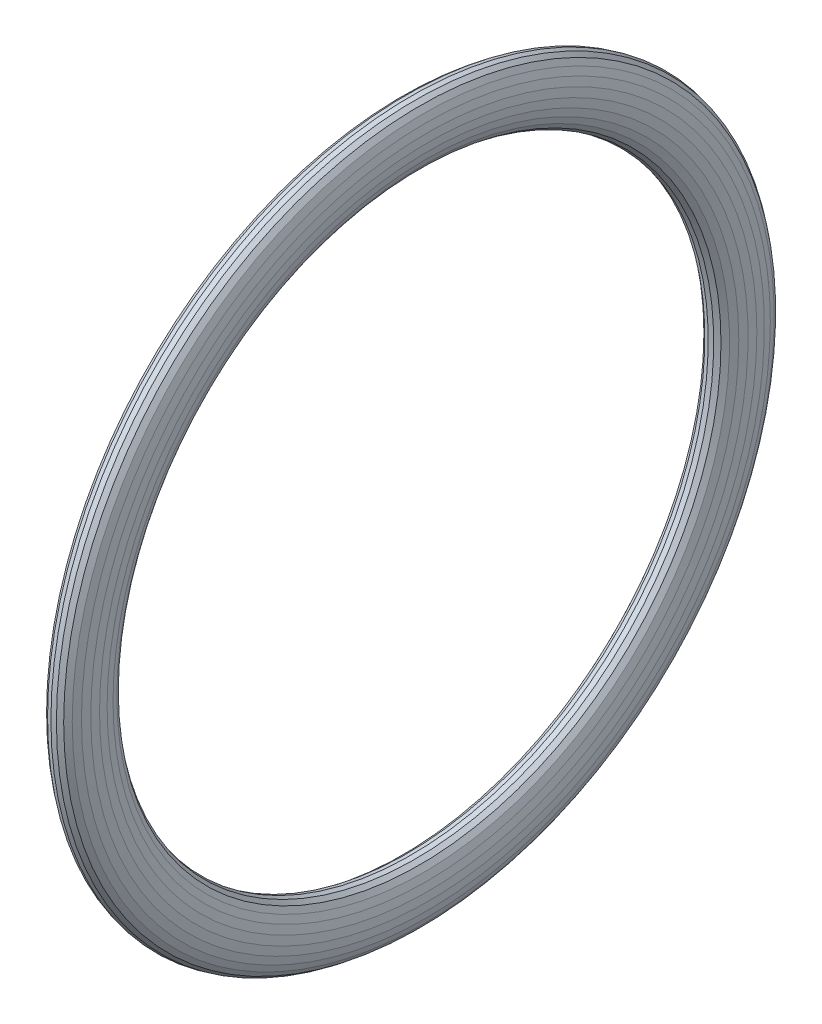
ISO-10303-21;
HEADER;
FILE_DESCRIPTION(('STEP AP214'),'2;1');
FILE_NAME('part.step','',(''),(''),'','','');
FILE_SCHEMA(('AUTOMOTIVE_DESIGN { 1 0 10303 214 1 1 1 1 }'));
ENDSEC;
DATA;
#1=APPLICATION_CONTEXT('core data for automotive mechanical design processes');
#2=APPLICATION_PROTOCOL_DEFINITION('international standard','automotive_design',2000,#1);
#3=PRODUCT_CONTEXT('',#1,'mechanical');
#4=PRODUCT('Part','Part','',(#3));
#5=PRODUCT_RELATED_PRODUCT_CATEGORY('part','',(#4));
#6=PRODUCT_DEFINITION_FORMATION('','',#4);
#7=PRODUCT_DEFINITION_CONTEXT('part definition',#1,'design');
#8=PRODUCT_DEFINITION('design','',#6,#7);
#9=PRODUCT_DEFINITION_SHAPE('','',#8);
#10=(LENGTH_UNIT() NAMED_UNIT(*) SI_UNIT(.MILLI.,.METRE.));
#11=(NAMED_UNIT(*) PLANE_ANGLE_UNIT() SI_UNIT($,.RADIAN.));
#12=(NAMED_UNIT(*) SI_UNIT($,.STERADIAN.) SOLID_ANGLE_UNIT());
#13=UNCERTAINTY_MEASURE_WITH_UNIT(LENGTH_MEASURE(1.E-05),#10,'distance_accuracy_value','');
#14=(GEOMETRIC_REPRESENTATION_CONTEXT(3) GLOBAL_UNCERTAINTY_ASSIGNED_CONTEXT((#13)) GLOBAL_UNIT_ASSIGNED_CONTEXT((#10,
#11,#12)) REPRESENTATION_CONTEXT('',''));
#15=CARTESIAN_POINT('',(0.,0.,0.));
#16=DIRECTION('',(0.,0.,1.));
#17=DIRECTION('',(1.,0.,0.));
#18=AXIS2_PLACEMENT_3D('',#15,#16,#17);
#19=CARTESIAN_POINT('',(-1.29500000000005,0.,0.));
#20=DIRECTION('',(-1.,0.,0.));
#21=DIRECTION('',(0.,0.,1.));
#22=AXIS2_PLACEMENT_3D('',#19,#20,#21);
#23=CONICAL_SURFACE('',#22,12.4,1.49955920854288);
#24=CARTESIAN_POINT('',(-1.27302215795644,0.,0.));
#25=DIRECTION('',(-1.,0.,0.));
#26=DIRECTION('',(0.,0.,1.));
#27=AXIS2_PLACEMENT_3D('',#24,#25,#26);
#28=CIRCLE('',#27,12.092005336328);
#29=CARTESIAN_POINT('',(-1.27302215795644,0.,12.092005336328));
#30=VERTEX_POINT('',#29);
#31=EDGE_CURVE('E113',#30,#30,#28,.T.);
#32=ORIENTED_EDGE('',*,*,#31,.F.);
#33=EDGE_LOOP('',(#32));
#34=FACE_BOUND('',#33,.T.);
#35=CARTESIAN_POINT('',(-1.29500000000005,0.,0.));
#36=DIRECTION('',(-1.,0.,0.));
#37=DIRECTION('',(0.,0.,1.));
#38=AXIS2_PLACEMENT_3D('',#35,#36,#37);
#39=CIRCLE('',#38,12.4);
#40=CARTESIAN_POINT('',(-1.29500000000005,0.,12.4));
#41=VERTEX_POINT('',#40);
#42=EDGE_CURVE('E10',#41,#41,#39,.T.);
#43=ORIENTED_EDGE('',*,*,#42,.T.);
#44=EDGE_LOOP('',(#43));
#45=FACE_BOUND('',#44,.T.);
#46=ADVANCED_FACE('F39',(#34,#45),#23,.F.);
#47=CARTESIAN_POINT('',(-1.27302215795644,0.,0.));
#48=DIRECTION('',(1.,0.,0.));
#49=DIRECTION('',(0.,0.,-1.));
#50=AXIS2_PLACEMENT_3D('',#47,#48,#49);
#51=CONICAL_SURFACE('',#50,12.707994663672,1.49955920854288);
#52=ORIENTED_EDGE('',*,*,#42,.F.);
#53=EDGE_LOOP('',(#52));
#54=FACE_BOUND('',#53,.T.);
#55=CARTESIAN_POINT('',(-1.27302215795644,0.,0.));
#56=DIRECTION('',(-1.,0.,0.));
#57=DIRECTION('',(0.,0.,1.));
#58=AXIS2_PLACEMENT_3D('',#55,#56,#57);
#59=CIRCLE('',#58,12.707994663672);
#60=CARTESIAN_POINT('',(-1.27302215795644,0.,12.707994663672));
#61=VERTEX_POINT('',#60);
#62=EDGE_CURVE('E44',#61,#61,#59,.T.);
#63=ORIENTED_EDGE('',*,*,#62,.T.);
#64=EDGE_LOOP('',(#63));
#65=FACE_BOUND('',#64,.T.);
#66=ADVANCED_FACE('F125',(#54,#65),#51,.T.);
#67=CARTESIAN_POINT('',(-1.20858638544097,0.,0.));
#68=DIRECTION('',(1.,0.,0.));
#69=DIRECTION('',(0.,0.,-1.));
#70=AXIS2_PLACEMENT_3D('',#67,#68,#69);
#71=CONICAL_SURFACE('',#70,12.995,1.34994764421995);
#72=ORIENTED_EDGE('',*,*,#62,.F.);
#73=EDGE_LOOP('',(#72));
#74=FACE_BOUND('',#73,.T.);
#75=CARTESIAN_POINT('',(-1.20858638544097,0.,0.));
#76=DIRECTION('',(-1.,0.,0.));
#77=DIRECTION('',(0.,0.,1.));
#78=AXIS2_PLACEMENT_3D('',#75,#76,#77);
#79=CIRCLE('',#78,12.995);
#80=CARTESIAN_POINT('',(-1.20858638544097,0.,12.995));
#81=VERTEX_POINT('',#80);
#82=EDGE_CURVE('E47',#81,#81,#79,.T.);
#83=ORIENTED_EDGE('',*,*,#82,.T.);
#84=EDGE_LOOP('',(#83));
#85=FACE_BOUND('',#84,.T.);
#86=ADVANCED_FACE('F127',(#74,#85),#71,.T.);
#87=CARTESIAN_POINT('',(-1.10608387386535,0.,0.));
#88=DIRECTION('',(1.,0.,0.));
#89=DIRECTION('',(0.,0.,-1.));
#90=AXIS2_PLACEMENT_3D('',#87,#88,#89);
#91=CONICAL_SURFACE('',#90,13.241457069612,1.17665512367415);
#92=ORIENTED_EDGE('',*,*,#82,.F.);
#93=EDGE_LOOP('',(#92));
#94=FACE_BOUND('',#93,.T.);
#95=CARTESIAN_POINT('',(-1.10608387386535,0.,0.));
#96=DIRECTION('',(-1.,0.,0.));
#97=DIRECTION('',(0.,0.,1.));
#98=AXIS2_PLACEMENT_3D('',#95,#96,#97);
#99=CIRCLE('',#98,13.241457069612);
#100=CARTESIAN_POINT('',(-1.10608387386535,0.,13.241457069612));
#101=VERTEX_POINT('',#100);
#102=EDGE_CURVE('E52',#101,#101,#99,.T.);
#103=ORIENTED_EDGE('',*,*,#102,.T.);
#104=EDGE_LOOP('',(#103));
#105=FACE_BOUND('',#104,.T.);
#106=ADVANCED_FACE('F132',(#94,#105),#91,.T.);
#107=CARTESIAN_POINT('',(-0.972500000000043,0.,0.));
#108=DIRECTION('',(1.,0.,0.));
#109=DIRECTION('',(0.,0.,-1.));
#110=AXIS2_PLACEMENT_3D('',#107,#108,#109);
#111=CONICAL_SURFACE('',#110,13.4305702305035,0.955807939491796);
#112=ORIENTED_EDGE('',*,*,#102,.F.);
#113=EDGE_LOOP('',(#112));
#114=FACE_BOUND('',#113,.T.);
#115=CARTESIAN_POINT('',(-0.972500000000043,0.,0.));
#116=DIRECTION('',(-1.,0.,0.));
#117=DIRECTION('',(0.,0.,1.));
#118=AXIS2_PLACEMENT_3D('',#115,#116,#117);
#119=CIRCLE('',#118,13.4305702305035);
#120=CARTESIAN_POINT('',(-0.972500000000043,0.,13.4305702305035));
#121=VERTEX_POINT('',#120);
#122=EDGE_CURVE('E59',#121,#121,#119,.T.);
#123=ORIENTED_EDGE('',*,*,#122,.T.);
#124=EDGE_LOOP('',(#123));
#125=FACE_BOUND('',#124,.T.);
#126=ADVANCED_FACE('F140',(#114,#125),#111,.T.);
#127=CARTESIAN_POINT('',(-0.816938284091129,0.,0.));
#128=DIRECTION('',(1.,0.,0.));
#129=DIRECTION('',(0.,0.,-1.));
#130=AXIS2_PLACEMENT_3D('',#127,#128,#129);
#131=CONICAL_SURFACE('',#130,13.549451733284,0.652532369342368);
#132=ORIENTED_EDGE('',*,*,#122,.F.);
#133=EDGE_LOOP('',(#132));
#134=FACE_BOUND('',#133,.T.);
#135=CARTESIAN_POINT('',(-0.816938284091129,0.,0.));
#136=DIRECTION('',(-1.,0.,0.));
#137=DIRECTION('',(0.,0.,1.));
#138=AXIS2_PLACEMENT_3D('',#135,#136,#137);
#139=CIRCLE('',#138,13.549451733284);
#140=CARTESIAN_POINT('',(-0.816938284091129,0.,13.549451733284));
#141=VERTEX_POINT('',#140);
#142=EDGE_CURVE('E62',#141,#141,#139,.T.);
#143=ORIENTED_EDGE('',*,*,#142,.T.);
#144=EDGE_LOOP('',(#143));
#145=FACE_BOUND('',#144,.T.);
#146=ADVANCED_FACE('F143',(#134,#145),#131,.T.);
#147=CARTESIAN_POINT('',(-0.650000000000039,0.,0.));
#148=DIRECTION('',(1.,0.,0.));
#149=DIRECTION('',(0.,0.,-1.));
#150=AXIS2_PLACEMENT_3D('',#147,#148,#149);
#151=CONICAL_SURFACE('',#150,13.59,0.238279331153076);
#152=ORIENTED_EDGE('',*,*,#142,.F.);
#153=EDGE_LOOP('',(#152));
#154=FACE_BOUND('',#153,.T.);
#155=CARTESIAN_POINT('',(-0.650000000000039,0.,0.));
#156=DIRECTION('',(-1.,0.,0.));
#157=DIRECTION('',(0.,0.,1.));
#158=AXIS2_PLACEMENT_3D('',#155,#156,#157);
#159=CIRCLE('',#158,13.59);
#160=CARTESIAN_POINT('',(-0.650000000000039,0.,13.59));
#161=VERTEX_POINT('',#160);
#162=EDGE_CURVE('E61',#161,#161,#159,.T.);
#163=ORIENTED_EDGE('',*,*,#162,.T.);
#164=EDGE_LOOP('',(#163));
#165=FACE_BOUND('',#164,.T.);
#166=ADVANCED_FACE('F144',(#154,#165),#151,.T.);
#167=CARTESIAN_POINT('',(-0.483061715908839,0.,0.));
#168=DIRECTION('',(-1.,0.,0.));
#169=DIRECTION('',(0.,0.,1.));
#170=AXIS2_PLACEMENT_3D('',#167,#168,#169);
#171=CONICAL_SURFACE('',#170,13.549451733284,0.238279331152924);
#172=ORIENTED_EDGE('',*,*,#162,.F.);
#173=EDGE_LOOP('',(#172));
#174=FACE_BOUND('',#173,.T.);
#175=CARTESIAN_POINT('',(-0.483061715908839,0.,0.));
#176=DIRECTION('',(-1.,0.,0.));
#177=DIRECTION('',(0.,0.,1.));
#178=AXIS2_PLACEMENT_3D('',#175,#176,#177);
#179=CIRCLE('',#178,13.549451733284);
#180=CARTESIAN_POINT('',(-0.483061715908839,0.,13.549451733284));
#181=VERTEX_POINT('',#180);
#182=EDGE_CURVE('E70',#181,#181,#179,.T.);
#183=ORIENTED_EDGE('',*,*,#182,.T.);
#184=EDGE_LOOP('',(#183));
#185=FACE_BOUND('',#184,.T.);
#186=ADVANCED_FACE('F149',(#174,#185),#171,.T.);
#187=CARTESIAN_POINT('',(-0.327500000000036,0.,0.));
#188=DIRECTION('',(-1.,0.,0.));
#189=DIRECTION('',(0.,0.,1.));
#190=AXIS2_PLACEMENT_3D('',#187,#188,#189);
#191=CONICAL_SURFACE('',#190,13.4305702305035,0.652532369342712);
#192=ORIENTED_EDGE('',*,*,#182,.F.);
#193=EDGE_LOOP('',(#192));
#194=FACE_BOUND('',#193,.T.);
#195=CARTESIAN_POINT('',(-0.327500000000036,0.,0.));
#196=DIRECTION('',(-1.,0.,0.));
#197=DIRECTION('',(0.,0.,1.));
#198=AXIS2_PLACEMENT_3D('',#195,#196,#197);
#199=CIRCLE('',#198,13.4305702305035);
#200=CARTESIAN_POINT('',(-0.327500000000036,0.,13.4305702305035));
#201=VERTEX_POINT('',#200);
#202=EDGE_CURVE('E68',#201,#201,#199,.T.);
#203=ORIENTED_EDGE('',*,*,#202,.T.);
#204=EDGE_LOOP('',(#203));
#205=FACE_BOUND('',#204,.T.);
#206=ADVANCED_FACE('F153',(#194,#205),#191,.T.);
#207=CARTESIAN_POINT('',(-0.19391612613473,0.,0.));
#208=DIRECTION('',(-1.,0.,0.));
#209=DIRECTION('',(0.,0.,1.));
#210=AXIS2_PLACEMENT_3D('',#207,#208,#209);
#211=CONICAL_SURFACE('',#210,13.241457069612,0.955807939491796);
#212=ORIENTED_EDGE('',*,*,#202,.F.);
#213=EDGE_LOOP('',(#212));
#214=FACE_BOUND('',#213,.T.);
#215=CARTESIAN_POINT('',(-0.19391612613473,0.,0.));
#216=DIRECTION('',(-1.,0.,0.));
#217=DIRECTION('',(0.,0.,1.));
#218=AXIS2_PLACEMENT_3D('',#215,#216,#217);
#219=CIRCLE('',#218,13.241457069612);
#220=CARTESIAN_POINT('',(-0.19391612613473,0.,13.241457069612));
#221=VERTEX_POINT('',#220);
#222=EDGE_CURVE('E71',#221,#221,#219,.T.);
#223=ORIENTED_EDGE('',*,*,#222,.T.);
#224=EDGE_LOOP('',(#223));
#225=FACE_BOUND('',#224,.T.);
#226=ADVANCED_FACE('F160',(#214,#225),#211,.T.);
#227=CARTESIAN_POINT('',(-0.0914136145589994,0.,0.));
#228=DIRECTION('',(-1.,0.,0.));
#229=DIRECTION('',(0.,0.,1.));
#230=AXIS2_PLACEMENT_3D('',#227,#228,#229);
#231=CONICAL_SURFACE('',#230,12.995,1.17665512367376);
#232=ORIENTED_EDGE('',*,*,#222,.F.);
#233=EDGE_LOOP('',(#232));
#234=FACE_BOUND('',#233,.T.);
#235=CARTESIAN_POINT('',(-0.0914136145589994,0.,0.));
#236=DIRECTION('',(-1.,0.,0.));
#237=DIRECTION('',(0.,0.,1.));
#238=AXIS2_PLACEMENT_3D('',#235,#236,#237);
#239=CIRCLE('',#238,12.995);
#240=CARTESIAN_POINT('',(-0.0914136145589994,0.,12.995));
#241=VERTEX_POINT('',#240);
#242=EDGE_CURVE('E77',#241,#241,#239,.T.);
#243=ORIENTED_EDGE('',*,*,#242,.T.);
#244=EDGE_LOOP('',(#243));
#245=FACE_BOUND('',#244,.T.);
#246=ADVANCED_FACE('F161',(#234,#245),#231,.T.);
#247=CARTESIAN_POINT('',(-0.0269778420435296,0.,0.));
#248=DIRECTION('',(-1.,0.,0.));
#249=DIRECTION('',(0.,0.,1.));
#250=AXIS2_PLACEMENT_3D('',#247,#248,#249);
#251=CONICAL_SURFACE('',#250,12.707994663672,1.34994764421995);
#252=ORIENTED_EDGE('',*,*,#242,.F.);
#253=EDGE_LOOP('',(#252));
#254=FACE_BOUND('',#253,.T.);
#255=CARTESIAN_POINT('',(-0.0269778420435296,0.,0.));
#256=DIRECTION('',(-1.,0.,0.));
#257=DIRECTION('',(0.,0.,1.));
#258=AXIS2_PLACEMENT_3D('',#255,#256,#257);
#259=CIRCLE('',#258,12.707994663672);
#260=CARTESIAN_POINT('',(-0.0269778420435296,0.,12.707994663672));
#261=VERTEX_POINT('',#260);
#262=EDGE_CURVE('E76',#261,#261,#259,.T.);
#263=ORIENTED_EDGE('',*,*,#262,.T.);
#264=EDGE_LOOP('',(#263));
#265=FACE_BOUND('',#264,.T.);
#266=ADVANCED_FACE('F164',(#254,#265),#251,.T.);
#267=CARTESIAN_POINT('',(-0.00500000000003276,0.,0.));
#268=DIRECTION('',(-1.,0.,0.));
#269=DIRECTION('',(0.,0.,1.));
#270=AXIS2_PLACEMENT_3D('',#267,#268,#269);
#271=CONICAL_SURFACE('',#270,12.4,1.49955920854324);
#272=ORIENTED_EDGE('',*,*,#262,.F.);
#273=EDGE_LOOP('',(#272));
#274=FACE_BOUND('',#273,.T.);
#275=CARTESIAN_POINT('',(-0.00500000000003276,0.,0.));
#276=DIRECTION('',(-1.,0.,0.));
#277=DIRECTION('',(0.,0.,1.));
#278=AXIS2_PLACEMENT_3D('',#275,#276,#277);
#279=CIRCLE('',#278,12.4);
#280=CARTESIAN_POINT('',(-0.00500000000003276,0.,12.4));
#281=VERTEX_POINT('',#280);
#282=EDGE_CURVE('E85',#281,#281,#279,.T.);
#283=ORIENTED_EDGE('',*,*,#282,.T.);
#284=EDGE_LOOP('',(#283));
#285=FACE_BOUND('',#284,.T.);
#286=ADVANCED_FACE('F166',(#274,#285),#271,.T.);
#287=CARTESIAN_POINT('',(-0.0269778420435296,0.,0.));
#288=DIRECTION('',(1.,0.,0.));
#289=DIRECTION('',(0.,0.,-1.));
#290=AXIS2_PLACEMENT_3D('',#287,#288,#289);
#291=CONICAL_SURFACE('',#290,12.092005336328,1.49955920854324);
#292=ORIENTED_EDGE('',*,*,#282,.F.);
#293=EDGE_LOOP('',(#292));
#294=FACE_BOUND('',#293,.T.);
#295=CARTESIAN_POINT('',(-0.0269778420435296,0.,0.));
#296=DIRECTION('',(-1.,0.,0.));
#297=DIRECTION('',(0.,0.,1.));
#298=AXIS2_PLACEMENT_3D('',#295,#296,#297);
#299=CIRCLE('',#298,12.092005336328);
#300=CARTESIAN_POINT('',(-0.0269778420435296,0.,12.092005336328));
#301=VERTEX_POINT('',#300);
#302=EDGE_CURVE('E83',#301,#301,#299,.T.);
#303=ORIENTED_EDGE('',*,*,#302,.T.);
#304=EDGE_LOOP('',(#303));
#305=FACE_BOUND('',#304,.T.);
#306=ADVANCED_FACE('F174',(#294,#305),#291,.F.);
#307=CARTESIAN_POINT('',(-0.0914136145589994,0.,0.));
#308=DIRECTION('',(1.,0.,0.));
#309=DIRECTION('',(0.,0.,-1.));
#310=AXIS2_PLACEMENT_3D('',#307,#308,#309);
#311=CONICAL_SURFACE('',#310,11.805,1.34994764421995);
#312=ORIENTED_EDGE('',*,*,#302,.F.);
#313=EDGE_LOOP('',(#312));
#314=FACE_BOUND('',#313,.T.);
#315=CARTESIAN_POINT('',(-0.0914136145589994,0.,0.));
#316=DIRECTION('',(-1.,0.,0.));
#317=DIRECTION('',(0.,0.,1.));
#318=AXIS2_PLACEMENT_3D('',#315,#316,#317);
#319=CIRCLE('',#318,11.805);
#320=CARTESIAN_POINT('',(-0.0914136145589994,0.,11.805));
#321=VERTEX_POINT('',#320);
#322=EDGE_CURVE('E86',#321,#321,#319,.T.);
#323=ORIENTED_EDGE('',*,*,#322,.T.);
#324=EDGE_LOOP('',(#323));
#325=FACE_BOUND('',#324,.T.);
#326=ADVANCED_FACE('F180',(#314,#325),#311,.F.);
#327=CARTESIAN_POINT('',(-0.19391612613473,0.,0.));
#328=DIRECTION('',(1.,0.,0.));
#329=DIRECTION('',(0.,0.,-1.));
#330=AXIS2_PLACEMENT_3D('',#327,#328,#329);
#331=CONICAL_SURFACE('',#330,11.558542930388,1.17665512367376);
#332=ORIENTED_EDGE('',*,*,#322,.F.);
#333=EDGE_LOOP('',(#332));
#334=FACE_BOUND('',#333,.T.);
#335=CARTESIAN_POINT('',(-0.19391612613473,0.,0.));
#336=DIRECTION('',(-1.,0.,0.));
#337=DIRECTION('',(0.,0.,1.));
#338=AXIS2_PLACEMENT_3D('',#335,#336,#337);
#339=CIRCLE('',#338,11.558542930388);
#340=CARTESIAN_POINT('',(-0.19391612613473,0.,11.558542930388));
#341=VERTEX_POINT('',#340);
#342=EDGE_CURVE('E93',#341,#341,#339,.T.);
#343=ORIENTED_EDGE('',*,*,#342,.T.);
#344=EDGE_LOOP('',(#343));
#345=FACE_BOUND('',#344,.T.);
#346=ADVANCED_FACE('F182',(#334,#345),#331,.F.);
#347=CARTESIAN_POINT('',(-0.327500000000036,0.,0.));
#348=DIRECTION('',(1.,0.,0.));
#349=DIRECTION('',(0.,0.,-1.));
#350=AXIS2_PLACEMENT_3D('',#347,#348,#349);
#351=CONICAL_SURFACE('',#350,11.3694297694965,0.955807939491796);
#352=ORIENTED_EDGE('',*,*,#342,.F.);
#353=EDGE_LOOP('',(#352));
#354=FACE_BOUND('',#353,.T.);
#355=CARTESIAN_POINT('',(-0.327500000000036,0.,0.));
#356=DIRECTION('',(-1.,0.,0.));
#357=DIRECTION('',(0.,0.,1.));
#358=AXIS2_PLACEMENT_3D('',#355,#356,#357);
#359=CIRCLE('',#358,11.3694297694965);
#360=CARTESIAN_POINT('',(-0.327500000000036,0.,11.3694297694965));
#361=VERTEX_POINT('',#360);
#362=EDGE_CURVE('E94',#361,#361,#359,.T.);
#363=ORIENTED_EDGE('',*,*,#362,.T.);
#364=EDGE_LOOP('',(#363));
#365=FACE_BOUND('',#364,.T.);
#366=ADVANCED_FACE('F183',(#354,#365),#351,.F.);
#367=CARTESIAN_POINT('',(-0.483061715908839,0.,0.));
#368=DIRECTION('',(1.,0.,0.));
#369=DIRECTION('',(0.,0.,-1.));
#370=AXIS2_PLACEMENT_3D('',#367,#368,#369);
#371=CONICAL_SURFACE('',#370,11.250548266716,0.652532369342712);
#372=ORIENTED_EDGE('',*,*,#362,.F.);
#373=EDGE_LOOP('',(#372));
#374=FACE_BOUND('',#373,.T.);
#375=CARTESIAN_POINT('',(-0.483061715908839,0.,0.));
#376=DIRECTION('',(-1.,0.,0.));
#377=DIRECTION('',(0.,0.,1.));
#378=AXIS2_PLACEMENT_3D('',#375,#376,#377);
#379=CIRCLE('',#378,11.250548266716);
#380=CARTESIAN_POINT('',(-0.483061715908839,0.,11.250548266716));
#381=VERTEX_POINT('',#380);
#382=EDGE_CURVE('E100',#381,#381,#379,.T.);
#383=ORIENTED_EDGE('',*,*,#382,.T.);
#384=EDGE_LOOP('',(#383));
#385=FACE_BOUND('',#384,.T.);
#386=ADVANCED_FACE('F186',(#374,#385),#371,.F.);
#387=CARTESIAN_POINT('',(-0.650000000000039,0.,0.));
#388=DIRECTION('',(1.,0.,0.));
#389=DIRECTION('',(0.,0.,-1.));
#390=AXIS2_PLACEMENT_3D('',#387,#388,#389);
#391=CONICAL_SURFACE('',#390,11.21,0.238279331152924);
#392=ORIENTED_EDGE('',*,*,#382,.F.);
#393=EDGE_LOOP('',(#392));
#394=FACE_BOUND('',#393,.T.);
#395=CARTESIAN_POINT('',(-0.650000000000039,0.,0.));
#396=DIRECTION('',(-1.,0.,0.));
#397=DIRECTION('',(0.,0.,1.));
#398=AXIS2_PLACEMENT_3D('',#395,#396,#397);
#399=CIRCLE('',#398,11.21);
#400=CARTESIAN_POINT('',(-0.650000000000039,0.,11.21));
#401=VERTEX_POINT('',#400);
#402=EDGE_CURVE('E99',#401,#401,#399,.T.);
#403=ORIENTED_EDGE('',*,*,#402,.T.);
#404=EDGE_LOOP('',(#403));
#405=FACE_BOUND('',#404,.T.);
#406=ADVANCED_FACE('F194',(#394,#405),#391,.F.);
#407=CARTESIAN_POINT('',(-0.816938284091129,0.,0.));
#408=DIRECTION('',(-1.,0.,0.));
#409=DIRECTION('',(0.,0.,1.));
#410=AXIS2_PLACEMENT_3D('',#407,#408,#409);
#411=CONICAL_SURFACE('',#410,11.250548266716,0.238279331153076);
#412=ORIENTED_EDGE('',*,*,#402,.F.);
#413=EDGE_LOOP('',(#412));
#414=FACE_BOUND('',#413,.T.);
#415=CARTESIAN_POINT('',(-0.816938284091129,0.,0.));
#416=DIRECTION('',(-1.,0.,0.));
#417=DIRECTION('',(0.,0.,1.));
#418=AXIS2_PLACEMENT_3D('',#415,#416,#417);
#419=CIRCLE('',#418,11.250548266716);
#420=CARTESIAN_POINT('',(-0.816938284091129,0.,11.250548266716));
#421=VERTEX_POINT('',#420);
#422=EDGE_CURVE('E103',#421,#421,#419,.T.);
#423=ORIENTED_EDGE('',*,*,#422,.T.);
#424=EDGE_LOOP('',(#423));
#425=FACE_BOUND('',#424,.T.);
#426=ADVANCED_FACE('F197',(#414,#425),#411,.F.);
#427=CARTESIAN_POINT('',(-0.972500000000043,0.,0.));
#428=DIRECTION('',(-1.,0.,0.));
#429=DIRECTION('',(0.,0.,1.));
#430=AXIS2_PLACEMENT_3D('',#427,#428,#429);
#431=CONICAL_SURFACE('',#430,11.3694297694965,0.652532369342368);
#432=ORIENTED_EDGE('',*,*,#422,.F.);
#433=EDGE_LOOP('',(#432));
#434=FACE_BOUND('',#433,.T.);
#435=CARTESIAN_POINT('',(-0.972500000000043,0.,0.));
#436=DIRECTION('',(-1.,0.,0.));
#437=DIRECTION('',(0.,0.,1.));
#438=AXIS2_PLACEMENT_3D('',#435,#436,#437);
#439=CIRCLE('',#438,11.3694297694965);
#440=CARTESIAN_POINT('',(-0.972500000000043,0.,11.3694297694965));
#441=VERTEX_POINT('',#440);
#442=EDGE_CURVE('E106',#441,#441,#439,.T.);
#443=ORIENTED_EDGE('',*,*,#442,.T.);
#444=EDGE_LOOP('',(#443));
#445=FACE_BOUND('',#444,.T.);
#446=ADVANCED_FACE('F203',(#434,#445),#431,.F.);
#447=CARTESIAN_POINT('',(-1.10608387386535,0.,0.));
#448=DIRECTION('',(-1.,0.,0.));
#449=DIRECTION('',(0.,0.,1.));
#450=AXIS2_PLACEMENT_3D('',#447,#448,#449);
#451=CONICAL_SURFACE('',#450,11.558542930388,0.955807939491796);
#452=ORIENTED_EDGE('',*,*,#442,.F.);
#453=EDGE_LOOP('',(#452));
#454=FACE_BOUND('',#453,.T.);
#455=CARTESIAN_POINT('',(-1.10608387386535,0.,0.));
#456=DIRECTION('',(-1.,0.,0.));
#457=DIRECTION('',(0.,0.,1.));
#458=AXIS2_PLACEMENT_3D('',#455,#456,#457);
#459=CIRCLE('',#458,11.558542930388);
#460=CARTESIAN_POINT('',(-1.10608387386535,0.,11.558542930388));
#461=VERTEX_POINT('',#460);
#462=EDGE_CURVE('E108',#461,#461,#459,.T.);
#463=ORIENTED_EDGE('',*,*,#462,.T.);
#464=EDGE_LOOP('',(#463));
#465=FACE_BOUND('',#464,.T.);
#466=ADVANCED_FACE('F202',(#454,#465),#451,.F.);
#467=CARTESIAN_POINT('',(-1.20858638544097,0.,0.));
#468=DIRECTION('',(-1.,0.,0.));
#469=DIRECTION('',(0.,0.,1.));
#470=AXIS2_PLACEMENT_3D('',#467,#468,#469);
#471=CONICAL_SURFACE('',#470,11.805,1.17665512367415);
#472=ORIENTED_EDGE('',*,*,#462,.F.);
#473=EDGE_LOOP('',(#472));
#474=FACE_BOUND('',#473,.T.);
#475=CARTESIAN_POINT('',(-1.20858638544097,0.,0.));
#476=DIRECTION('',(-1.,0.,0.));
#477=DIRECTION('',(0.,0.,1.));
#478=AXIS2_PLACEMENT_3D('',#475,#476,#477);
#479=CIRCLE('',#478,11.805);
#480=CARTESIAN_POINT('',(-1.20858638544097,0.,11.805));
#481=VERTEX_POINT('',#480);
#482=EDGE_CURVE('E115',#481,#481,#479,.T.);
#483=ORIENTED_EDGE('',*,*,#482,.T.);
#484=EDGE_LOOP('',(#483));
#485=FACE_BOUND('',#484,.T.);
#486=ADVANCED_FACE('F207',(#474,#485),#471,.F.);
#487=CARTESIAN_POINT('',(-1.27302215795644,0.,0.));
#488=DIRECTION('',(-1.,0.,0.));
#489=DIRECTION('',(0.,0.,1.));
#490=AXIS2_PLACEMENT_3D('',#487,#488,#489);
#491=CONICAL_SURFACE('',#490,12.092005336328,1.34994764421995);
#492=ORIENTED_EDGE('',*,*,#482,.F.);
#493=EDGE_LOOP('',(#492));
#494=FACE_BOUND('',#493,.T.);
#495=ORIENTED_EDGE('',*,*,#31,.T.);
#496=EDGE_LOOP('',(#495));
#497=FACE_BOUND('',#496,.T.);
#498=ADVANCED_FACE('F116',(#494,#497),#491,.F.);
#499=CLOSED_SHELL('',(#46,#66,#86,#106,#126,#146,#166,#186,#206,#226,#246,#266,#286,#306,#326,
#346,#366,#386,#406,#426,#446,#466,#486,#498));
#500=MANIFOLD_SOLID_BREP('B2',#499);
#501=ADVANCED_BREP_SHAPE_REPRESENTATION('',(#18,#500),#14);
#502=SHAPE_DEFINITION_REPRESENTATION(#9,#501);
ENDSEC;
END-ISO-10303-21;
